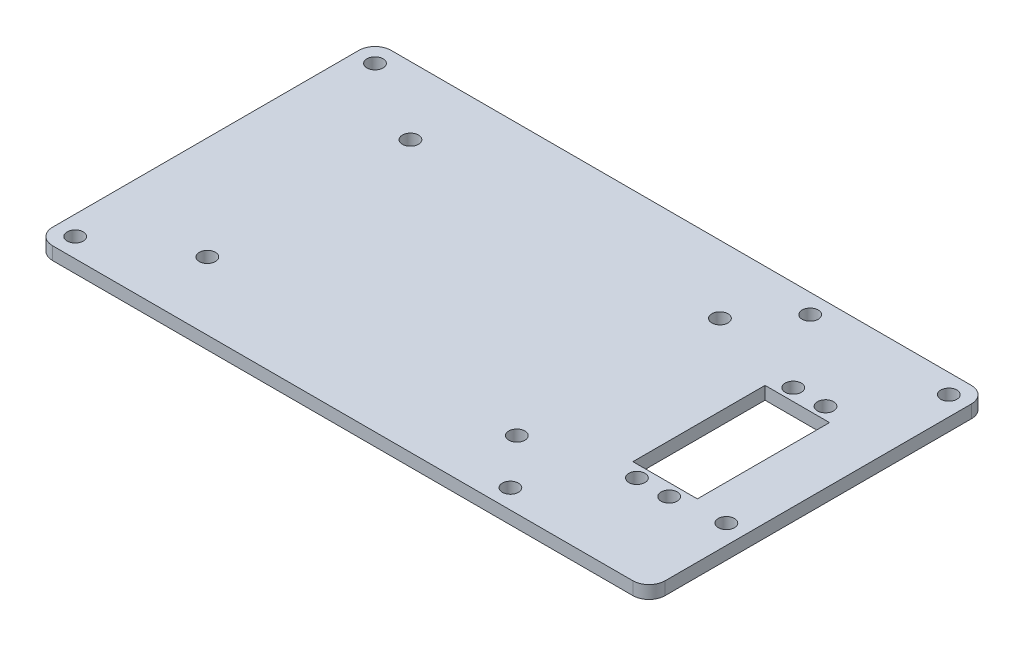
ISO-10303-21;
HEADER;
FILE_DESCRIPTION(('STEP AP214'),'2;1');
FILE_NAME('part.step','',(''),(''),'','','');
FILE_SCHEMA(('AUTOMOTIVE_DESIGN { 1 0 10303 214 1 1 1 1 }'));
ENDSEC;
DATA;
#1=APPLICATION_CONTEXT('core data for automotive mechanical design processes');
#2=APPLICATION_PROTOCOL_DEFINITION('international standard','automotive_design',2000,#1);
#3=PRODUCT_CONTEXT('',#1,'mechanical');
#4=PRODUCT('Part','Part','',(#3));
#5=PRODUCT_RELATED_PRODUCT_CATEGORY('part','',(#4));
#6=PRODUCT_DEFINITION_FORMATION('','',#4);
#7=PRODUCT_DEFINITION_CONTEXT('part definition',#1,'design');
#8=PRODUCT_DEFINITION('design','',#6,#7);
#9=PRODUCT_DEFINITION_SHAPE('','',#8);
#10=(LENGTH_UNIT() NAMED_UNIT(*) SI_UNIT(.MILLI.,.METRE.));
#11=(NAMED_UNIT(*) PLANE_ANGLE_UNIT() SI_UNIT($,.RADIAN.));
#12=(NAMED_UNIT(*) SI_UNIT($,.STERADIAN.) SOLID_ANGLE_UNIT());
#13=UNCERTAINTY_MEASURE_WITH_UNIT(LENGTH_MEASURE(1.E-05),#10,'distance_accuracy_value','');
#14=(GEOMETRIC_REPRESENTATION_CONTEXT(3) GLOBAL_UNCERTAINTY_ASSIGNED_CONTEXT((#13)) GLOBAL_UNIT_ASSIGNED_CONTEXT((#10,
#11,#12)) REPRESENTATION_CONTEXT('',''));
#15=CARTESIAN_POINT('',(0.,0.,0.));
#16=DIRECTION('',(0.,0.,1.));
#17=DIRECTION('',(1.,0.,0.));
#18=AXIS2_PLACEMENT_3D('',#15,#16,#17);
#19=CARTESIAN_POINT('',(0.,4.,0.));
#20=DIRECTION('',(0.,-1.,0.));
#21=DIRECTION('',(0.,0.,-1.));
#22=AXIS2_PLACEMENT_3D('',#19,#20,#21);
#23=PLANE('',#22);
#24=CARTESIAN_POINT('',(46.,4.,46.5));
#25=DIRECTION('',(0.,1.,0.));
#26=DIRECTION('',(0.,0.,1.));
#27=AXIS2_PLACEMENT_3D('',#24,#25,#26);
#28=CIRCLE('',#27,2.5);
#29=CARTESIAN_POINT('',(46.,4.,49.));
#30=VERTEX_POINT('',#29);
#31=EDGE_CURVE('E435',#30,#30,#28,.T.);
#32=ORIENTED_EDGE('',*,*,#31,.F.);
#33=EDGE_LOOP('',(#32));
#34=FACE_BOUND('',#33,.T.);
#35=CARTESIAN_POINT('',(73.,4.,24.25));
#36=DIRECTION('',(0.,1.,0.));
#37=DIRECTION('',(0.,0.,1.));
#38=AXIS2_PLACEMENT_3D('',#35,#36,#37);
#39=CIRCLE('',#38,2.5);
#40=CARTESIAN_POINT('',(73.,4.,26.75));
#41=VERTEX_POINT('',#40);
#42=EDGE_CURVE('E445',#41,#41,#39,.T.);
#43=ORIENTED_EDGE('',*,*,#42,.F.);
#44=EDGE_LOOP('',(#43));
#45=FACE_BOUND('',#44,.T.);
#46=CARTESIAN_POINT('',(73.,4.,-24.25));
#47=DIRECTION('',(0.,1.,0.));
#48=DIRECTION('',(0.,0.,1.));
#49=AXIS2_PLACEMENT_3D('',#46,#47,#48);
#50=CIRCLE('',#49,2.5);
#51=CARTESIAN_POINT('',(73.,4.,-21.75));
#52=VERTEX_POINT('',#51);
#53=EDGE_CURVE('E455',#52,#52,#50,.T.);
#54=ORIENTED_EDGE('',*,*,#53,.F.);
#55=EDGE_LOOP('',(#54));
#56=FACE_BOUND('',#55,.T.);
#57=DIRECTION('',(0.,0.,-1.));
#58=VECTOR('',#57,1.);
#59=CARTESIAN_POINT('',(78.,4.,-20.5));
#60=LINE('',#59,#58);
#61=CARTESIAN_POINT('',(78.,4.,20.5));
#62=VERTEX_POINT('',#61);
#63=CARTESIAN_POINT('',(78.,4.,-20.5));
#64=VERTEX_POINT('',#63);
#65=EDGE_CURVE('E127',#62,#64,#60,.T.);
#66=ORIENTED_EDGE('',*,*,#65,.F.);
#67=DIRECTION('',(1.,0.,0.));
#68=VECTOR('',#67,1.);
#69=CARTESIAN_POINT('',(58.,4.,20.5));
#70=LINE('',#69,#68);
#71=CARTESIAN_POINT('',(58.,4.,20.5));
#72=VERTEX_POINT('',#71);
#73=EDGE_CURVE('E153',#72,#62,#70,.T.);
#74=ORIENTED_EDGE('',*,*,#73,.F.);
#75=DIRECTION('',(0.,0.,1.));
#76=VECTOR('',#75,1.);
#77=CARTESIAN_POINT('',(58.,4.,-20.5));
#78=LINE('',#77,#76);
#79=CARTESIAN_POINT('',(58.,4.,-20.5));
#80=VERTEX_POINT('',#79);
#81=EDGE_CURVE('E151',#80,#72,#78,.T.);
#82=ORIENTED_EDGE('',*,*,#81,.F.);
#83=DIRECTION('',(-1.,0.,0.));
#84=VECTOR('',#83,1.);
#85=CARTESIAN_POINT('',(58.,4.,-20.5));
#86=LINE('',#85,#84);
#87=EDGE_CURVE('E137',#64,#80,#86,.T.);
#88=ORIENTED_EDGE('',*,*,#87,.F.);
#89=EDGE_LOOP('',(#66,#74,#82,#88));
#90=FACE_BOUND('',#89,.T.);
#91=CARTESIAN_POINT('',(-63.,4.,31.5));
#92=DIRECTION('',(0.,1.,0.));
#93=DIRECTION('',(0.,0.,1.));
#94=AXIS2_PLACEMENT_3D('',#91,#92,#93);
#95=CIRCLE('',#94,2.5);
#96=CARTESIAN_POINT('',(-63.,4.,34.));
#97=VERTEX_POINT('',#96);
#98=EDGE_CURVE('E177',#97,#97,#95,.T.);
#99=ORIENTED_EDGE('',*,*,#98,.F.);
#100=EDGE_LOOP('',(#99));
#101=FACE_BOUND('',#100,.T.);
#102=CARTESIAN_POINT('',(-63.,4.,-31.5));
#103=DIRECTION('',(0.,1.,0.));
#104=DIRECTION('',(0.,0.,1.));
#105=AXIS2_PLACEMENT_3D('',#102,#103,#104);
#106=CIRCLE('',#105,2.5);
#107=CARTESIAN_POINT('',(-63.,4.,-29.));
#108=VERTEX_POINT('',#107);
#109=EDGE_CURVE('E189',#108,#108,#106,.T.);
#110=ORIENTED_EDGE('',*,*,#109,.F.);
#111=EDGE_LOOP('',(#110));
#112=FACE_BOUND('',#111,.T.);
#113=CARTESIAN_POINT('',(89.,4.,-46.5));
#114=DIRECTION('',(0.,1.,0.));
#115=DIRECTION('',(0.,0.,1.));
#116=AXIS2_PLACEMENT_3D('',#113,#114,#115);
#117=CIRCLE('',#116,2.5);
#118=CARTESIAN_POINT('',(89.,4.,-44.));
#119=VERTEX_POINT('',#118);
#120=EDGE_CURVE('E201',#119,#119,#117,.T.);
#121=ORIENTED_EDGE('',*,*,#120,.F.);
#122=EDGE_LOOP('',(#121));
#123=FACE_BOUND('',#122,.T.);
#124=DIRECTION('',(-1.,0.,0.));
#125=VECTOR('',#124,1.);
#126=CARTESIAN_POINT('',(-95.,4.,-52.5));
#127=LINE('',#126,#125);
#128=CARTESIAN_POINT('',(90.,4.,-52.5));
#129=VERTEX_POINT('',#128);
#130=CARTESIAN_POINT('',(-90.,4.,-52.5));
#131=VERTEX_POINT('',#130);
#132=EDGE_CURVE('E216',#129,#131,#127,.T.);
#133=ORIENTED_EDGE('',*,*,#132,.T.);
#134=CARTESIAN_POINT('',(-90.,4.,-47.5));
#135=DIRECTION('',(0.,-1.,0.));
#136=DIRECTION('',(0.,0.,-1.));
#137=AXIS2_PLACEMENT_3D('',#134,#135,#136);
#138=CIRCLE('',#137,5.);
#139=CARTESIAN_POINT('',(-95.,4.,-47.5));
#140=VERTEX_POINT('',#139);
#141=EDGE_CURVE('E256',#131,#140,#138,.F.);
#142=ORIENTED_EDGE('',*,*,#141,.T.);
#143=DIRECTION('',(0.,0.,1.));
#144=VECTOR('',#143,1.);
#145=CARTESIAN_POINT('',(-95.,4.,52.5));
#146=LINE('',#145,#144);
#147=CARTESIAN_POINT('',(-95.,4.,47.5));
#148=VERTEX_POINT('',#147);
#149=EDGE_CURVE('E220',#140,#148,#146,.T.);
#150=ORIENTED_EDGE('',*,*,#149,.T.);
#151=CARTESIAN_POINT('',(-90.,4.,47.5));
#152=DIRECTION('',(0.,-1.,0.));
#153=DIRECTION('',(0.,0.,-1.));
#154=AXIS2_PLACEMENT_3D('',#151,#152,#153);
#155=CIRCLE('',#154,5.);
#156=CARTESIAN_POINT('',(-90.,4.,52.5));
#157=VERTEX_POINT('',#156);
#158=EDGE_CURVE('E57',#148,#157,#155,.F.);
#159=ORIENTED_EDGE('',*,*,#158,.T.);
#160=DIRECTION('',(1.,0.,0.));
#161=VECTOR('',#160,1.);
#162=CARTESIAN_POINT('',(-95.,4.,52.5));
#163=LINE('',#162,#161);
#164=CARTESIAN_POINT('',(90.,4.,52.5));
#165=VERTEX_POINT('',#164);
#166=EDGE_CURVE('E222',#157,#165,#163,.T.);
#167=ORIENTED_EDGE('',*,*,#166,.T.);
#168=CARTESIAN_POINT('',(90.,4.,47.5));
#169=DIRECTION('',(0.,-1.,0.));
#170=DIRECTION('',(0.,0.,-1.));
#171=AXIS2_PLACEMENT_3D('',#168,#169,#170);
#172=CIRCLE('',#171,5.);
#173=CARTESIAN_POINT('',(95.,4.,47.5));
#174=VERTEX_POINT('',#173);
#175=EDGE_CURVE('E253',#165,#174,#172,.F.);
#176=ORIENTED_EDGE('',*,*,#175,.T.);
#177=DIRECTION('',(0.,0.,-1.));
#178=VECTOR('',#177,1.);
#179=CARTESIAN_POINT('',(95.,4.,52.5));
#180=LINE('',#179,#178);
#181=CARTESIAN_POINT('',(95.,4.,-47.5));
#182=VERTEX_POINT('',#181);
#183=EDGE_CURVE('E213',#174,#182,#180,.T.);
#184=ORIENTED_EDGE('',*,*,#183,.T.);
#185=CARTESIAN_POINT('',(90.,4.,-47.5));
#186=DIRECTION('',(0.,-1.,0.));
#187=DIRECTION('',(0.,0.,-1.));
#188=AXIS2_PLACEMENT_3D('',#185,#186,#187);
#189=CIRCLE('',#188,5.);
#190=EDGE_CURVE('E251',#182,#129,#189,.F.);
#191=ORIENTED_EDGE('',*,*,#190,.T.);
#192=EDGE_LOOP('',(#133,#142,#150,#159,#167,#176,#184,#191));
#193=FACE_BOUND('',#192,.T.);
#194=CARTESIAN_POINT('',(-89.,4.,-46.5));
#195=DIRECTION('',(0.,1.,0.));
#196=DIRECTION('',(0.,0.,1.));
#197=AXIS2_PLACEMENT_3D('',#194,#195,#196);
#198=CIRCLE('',#197,2.5);
#199=CARTESIAN_POINT('',(-89.,4.,-44.));
#200=VERTEX_POINT('',#199);
#201=EDGE_CURVE('E207',#200,#200,#198,.T.);
#202=ORIENTED_EDGE('',*,*,#201,.F.);
#203=EDGE_LOOP('',(#202));
#204=FACE_BOUND('',#203,.T.);
#205=CARTESIAN_POINT('',(-89.,4.,46.5));
#206=DIRECTION('',(0.,1.,0.));
#207=DIRECTION('',(0.,0.,1.));
#208=AXIS2_PLACEMENT_3D('',#205,#206,#207);
#209=CIRCLE('',#208,2.5);
#210=CARTESIAN_POINT('',(-89.,4.,49.));
#211=VERTEX_POINT('',#210);
#212=EDGE_CURVE('E195',#211,#211,#209,.T.);
#213=ORIENTED_EDGE('',*,*,#212,.F.);
#214=EDGE_LOOP('',(#213));
#215=FACE_BOUND('',#214,.T.);
#216=CARTESIAN_POINT('',(33.,4.,-31.5));
#217=DIRECTION('',(0.,1.,0.));
#218=DIRECTION('',(0.,0.,1.));
#219=AXIS2_PLACEMENT_3D('',#216,#217,#218);
#220=CIRCLE('',#219,2.5);
#221=CARTESIAN_POINT('',(33.,4.,-29.));
#222=VERTEX_POINT('',#221);
#223=EDGE_CURVE('E183',#222,#222,#220,.T.);
#224=ORIENTED_EDGE('',*,*,#223,.F.);
#225=EDGE_LOOP('',(#224));
#226=FACE_BOUND('',#225,.T.);
#227=CARTESIAN_POINT('',(33.,4.,31.5));
#228=DIRECTION('',(0.,1.,0.));
#229=DIRECTION('',(0.,0.,1.));
#230=AXIS2_PLACEMENT_3D('',#227,#228,#229);
#231=CIRCLE('',#230,2.5);
#232=CARTESIAN_POINT('',(33.,4.,34.));
#233=VERTEX_POINT('',#232);
#234=EDGE_CURVE('E171',#233,#233,#231,.T.);
#235=ORIENTED_EDGE('',*,*,#234,.F.);
#236=EDGE_LOOP('',(#235));
#237=FACE_BOUND('',#236,.T.);
#238=CARTESIAN_POINT('',(62.9999999999999,4.,-24.25));
#239=DIRECTION('',(0.,1.,0.));
#240=DIRECTION('',(0.,0.,1.));
#241=AXIS2_PLACEMENT_3D('',#238,#239,#240);
#242=CIRCLE('',#241,2.5);
#243=CARTESIAN_POINT('',(62.9999999999999,4.,-21.75));
#244=VERTEX_POINT('',#243);
#245=EDGE_CURVE('E160',#244,#244,#242,.T.);
#246=ORIENTED_EDGE('',*,*,#245,.F.);
#247=EDGE_LOOP('',(#246));
#248=FACE_BOUND('',#247,.T.);
#249=CARTESIAN_POINT('',(62.9999999999999,4.,24.25));
#250=DIRECTION('',(0.,1.,0.));
#251=DIRECTION('',(0.,0.,1.));
#252=AXIS2_PLACEMENT_3D('',#249,#250,#251);
#253=CIRCLE('',#252,2.5);
#254=CARTESIAN_POINT('',(62.9999999999999,4.,26.75));
#255=VERTEX_POINT('',#254);
#256=EDGE_CURVE('E450',#255,#255,#253,.T.);
#257=ORIENTED_EDGE('',*,*,#256,.F.);
#258=EDGE_LOOP('',(#257));
#259=FACE_BOUND('',#258,.T.);
#260=CARTESIAN_POINT('',(46.,4.,-46.5));
#261=DIRECTION('',(0.,1.,0.));
#262=DIRECTION('',(0.,0.,1.));
#263=AXIS2_PLACEMENT_3D('',#260,#261,#262);
#264=CIRCLE('',#263,2.5);
#265=CARTESIAN_POINT('',(46.,4.,-44.));
#266=VERTEX_POINT('',#265);
#267=EDGE_CURVE('E440',#266,#266,#264,.T.);
#268=ORIENTED_EDGE('',*,*,#267,.F.);
#269=EDGE_LOOP('',(#268));
#270=FACE_BOUND('',#269,.T.);
#271=CARTESIAN_POINT('',(89.0000000000007,4.,22.5));
#272=DIRECTION('',(0.,1.,0.));
#273=DIRECTION('',(0.,0.,1.));
#274=AXIS2_PLACEMENT_3D('',#271,#272,#273);
#275=CIRCLE('',#274,2.5);
#276=CARTESIAN_POINT('',(89.0000000000007,4.,25.));
#277=VERTEX_POINT('',#276);
#278=EDGE_CURVE('E430',#277,#277,#275,.T.);
#279=ORIENTED_EDGE('',*,*,#278,.F.);
#280=EDGE_LOOP('',(#279));
#281=FACE_BOUND('',#280,.T.);
#282=ADVANCED_FACE('F35',(#34,#45,#56,#90,#101,#112,#123,#193,#204,#215,#226,#237,#248,#259,
#270,#281),#23,.F.);
#283=CARTESIAN_POINT('',(0.,0.,0.));
#284=DIRECTION('',(0.,-1.,0.));
#285=DIRECTION('',(0.,0.,-1.));
#286=AXIS2_PLACEMENT_3D('',#283,#284,#285);
#287=PLANE('',#286);
#288=CARTESIAN_POINT('',(46.,0.,46.5));
#289=DIRECTION('',(0.,1.,0.));
#290=DIRECTION('',(0.,0.,1.));
#291=AXIS2_PLACEMENT_3D('',#288,#289,#290);
#292=CIRCLE('',#291,2.5);
#293=CARTESIAN_POINT('',(46.,0.,49.));
#294=VERTEX_POINT('',#293);
#295=EDGE_CURVE('E432',#294,#294,#292,.T.);
#296=ORIENTED_EDGE('',*,*,#295,.T.);
#297=EDGE_LOOP('',(#296));
#298=FACE_BOUND('',#297,.T.);
#299=CARTESIAN_POINT('',(73.,0.,24.25));
#300=DIRECTION('',(0.,1.,0.));
#301=DIRECTION('',(0.,0.,1.));
#302=AXIS2_PLACEMENT_3D('',#299,#300,#301);
#303=CIRCLE('',#302,2.5);
#304=CARTESIAN_POINT('',(73.,0.,26.75));
#305=VERTEX_POINT('',#304);
#306=EDGE_CURVE('E443',#305,#305,#303,.T.);
#307=ORIENTED_EDGE('',*,*,#306,.T.);
#308=EDGE_LOOP('',(#307));
#309=FACE_BOUND('',#308,.T.);
#310=CARTESIAN_POINT('',(73.,0.,-24.25));
#311=DIRECTION('',(0.,1.,0.));
#312=DIRECTION('',(0.,0.,1.));
#313=AXIS2_PLACEMENT_3D('',#310,#311,#312);
#314=CIRCLE('',#313,2.5);
#315=CARTESIAN_POINT('',(73.,0.,-21.75));
#316=VERTEX_POINT('',#315);
#317=EDGE_CURVE('E453',#316,#316,#314,.T.);
#318=ORIENTED_EDGE('',*,*,#317,.T.);
#319=EDGE_LOOP('',(#318));
#320=FACE_BOUND('',#319,.T.);
#321=DIRECTION('',(1.,0.,0.));
#322=VECTOR('',#321,1.);
#323=CARTESIAN_POINT('',(58.,0.,20.5));
#324=LINE('',#323,#322);
#325=CARTESIAN_POINT('',(58.,0.,20.5));
#326=VERTEX_POINT('',#325);
#327=CARTESIAN_POINT('',(78.,0.,20.5));
#328=VERTEX_POINT('',#327);
#329=EDGE_CURVE('E138',#326,#328,#324,.T.);
#330=ORIENTED_EDGE('',*,*,#329,.T.);
#331=DIRECTION('',(0.,0.,-1.));
#332=VECTOR('',#331,1.);
#333=CARTESIAN_POINT('',(78.,0.,-20.5));
#334=LINE('',#333,#332);
#335=CARTESIAN_POINT('',(78.,0.,-20.5));
#336=VERTEX_POINT('',#335);
#337=EDGE_CURVE('E158',#328,#336,#334,.T.);
#338=ORIENTED_EDGE('',*,*,#337,.T.);
#339=DIRECTION('',(-1.,0.,0.));
#340=VECTOR('',#339,1.);
#341=CARTESIAN_POINT('',(58.,0.,-20.5));
#342=LINE('',#341,#340);
#343=CARTESIAN_POINT('',(58.,0.,-20.5));
#344=VERTEX_POINT('',#343);
#345=EDGE_CURVE('E144',#336,#344,#342,.T.);
#346=ORIENTED_EDGE('',*,*,#345,.T.);
#347=DIRECTION('',(0.,0.,1.));
#348=VECTOR('',#347,1.);
#349=CARTESIAN_POINT('',(58.,0.,-20.5));
#350=LINE('',#349,#348);
#351=EDGE_CURVE('E162',#344,#326,#350,.T.);
#352=ORIENTED_EDGE('',*,*,#351,.T.);
#353=EDGE_LOOP('',(#330,#338,#346,#352));
#354=FACE_BOUND('',#353,.T.);
#355=CARTESIAN_POINT('',(-63.,0.,31.5));
#356=DIRECTION('',(0.,1.,0.));
#357=DIRECTION('',(0.,0.,1.));
#358=AXIS2_PLACEMENT_3D('',#355,#356,#357);
#359=CIRCLE('',#358,2.5);
#360=CARTESIAN_POINT('',(-63.,0.,34.));
#361=VERTEX_POINT('',#360);
#362=EDGE_CURVE('E174',#361,#361,#359,.T.);
#363=ORIENTED_EDGE('',*,*,#362,.T.);
#364=EDGE_LOOP('',(#363));
#365=FACE_BOUND('',#364,.T.);
#366=CARTESIAN_POINT('',(-63.,0.,-31.5));
#367=DIRECTION('',(0.,1.,0.));
#368=DIRECTION('',(0.,0.,1.));
#369=AXIS2_PLACEMENT_3D('',#366,#367,#368);
#370=CIRCLE('',#369,2.5);
#371=CARTESIAN_POINT('',(-63.,0.,-29.));
#372=VERTEX_POINT('',#371);
#373=EDGE_CURVE('E186',#372,#372,#370,.T.);
#374=ORIENTED_EDGE('',*,*,#373,.T.);
#375=EDGE_LOOP('',(#374));
#376=FACE_BOUND('',#375,.T.);
#377=CARTESIAN_POINT('',(89.,0.,-46.5));
#378=DIRECTION('',(0.,1.,0.));
#379=DIRECTION('',(0.,0.,1.));
#380=AXIS2_PLACEMENT_3D('',#377,#378,#379);
#381=CIRCLE('',#380,2.5);
#382=CARTESIAN_POINT('',(89.,0.,-44.));
#383=VERTEX_POINT('',#382);
#384=EDGE_CURVE('E198',#383,#383,#381,.T.);
#385=ORIENTED_EDGE('',*,*,#384,.T.);
#386=EDGE_LOOP('',(#385));
#387=FACE_BOUND('',#386,.T.);
#388=DIRECTION('',(0.,0.,1.));
#389=VECTOR('',#388,1.);
#390=CARTESIAN_POINT('',(-95.,0.,52.5));
#391=LINE('',#390,#389);
#392=CARTESIAN_POINT('',(-95.,0.,-47.5));
#393=VERTEX_POINT('',#392);
#394=CARTESIAN_POINT('',(-95.,0.,47.5));
#395=VERTEX_POINT('',#394);
#396=EDGE_CURVE('E230',#393,#395,#391,.T.);
#397=ORIENTED_EDGE('',*,*,#396,.F.);
#398=CARTESIAN_POINT('',(-90.,0.,-47.5));
#399=DIRECTION('',(0.,-1.,0.));
#400=DIRECTION('',(0.,0.,-1.));
#401=AXIS2_PLACEMENT_3D('',#398,#399,#400);
#402=CIRCLE('',#401,5.);
#403=CARTESIAN_POINT('',(-90.,0.,-52.5));
#404=VERTEX_POINT('',#403);
#405=EDGE_CURVE('E244',#393,#404,#402,.T.);
#406=ORIENTED_EDGE('',*,*,#405,.T.);
#407=DIRECTION('',(-1.,0.,0.));
#408=VECTOR('',#407,1.);
#409=CARTESIAN_POINT('',(-95.,0.,-52.5));
#410=LINE('',#409,#408);
#411=CARTESIAN_POINT('',(90.,0.,-52.5));
#412=VERTEX_POINT('',#411);
#413=EDGE_CURVE('E227',#412,#404,#410,.T.);
#414=ORIENTED_EDGE('',*,*,#413,.F.);
#415=CARTESIAN_POINT('',(90.,0.,-47.5));
#416=DIRECTION('',(0.,-1.,0.));
#417=DIRECTION('',(0.,0.,-1.));
#418=AXIS2_PLACEMENT_3D('',#415,#416,#417);
#419=CIRCLE('',#418,5.);
#420=CARTESIAN_POINT('',(95.,0.,-47.5));
#421=VERTEX_POINT('',#420);
#422=EDGE_CURVE('E238',#412,#421,#419,.T.);
#423=ORIENTED_EDGE('',*,*,#422,.T.);
#424=DIRECTION('',(0.,0.,-1.));
#425=VECTOR('',#424,1.);
#426=CARTESIAN_POINT('',(95.,0.,52.5));
#427=LINE('',#426,#425);
#428=CARTESIAN_POINT('',(95.,0.,47.5));
#429=VERTEX_POINT('',#428);
#430=EDGE_CURVE('E210',#429,#421,#427,.T.);
#431=ORIENTED_EDGE('',*,*,#430,.F.);
#432=CARTESIAN_POINT('',(90.,0.,47.5));
#433=DIRECTION('',(0.,-1.,0.));
#434=DIRECTION('',(0.,0.,-1.));
#435=AXIS2_PLACEMENT_3D('',#432,#433,#434);
#436=CIRCLE('',#435,5.);
#437=CARTESIAN_POINT('',(90.,0.,52.5));
#438=VERTEX_POINT('',#437);
#439=EDGE_CURVE('E240',#429,#438,#436,.T.);
#440=ORIENTED_EDGE('',*,*,#439,.T.);
#441=DIRECTION('',(1.,0.,0.));
#442=VECTOR('',#441,1.);
#443=CARTESIAN_POINT('',(-95.,0.,52.5));
#444=LINE('',#443,#442);
#445=CARTESIAN_POINT('',(-90.,0.,52.5));
#446=VERTEX_POINT('',#445);
#447=EDGE_CURVE('E217',#446,#438,#444,.T.);
#448=ORIENTED_EDGE('',*,*,#447,.F.);
#449=CARTESIAN_POINT('',(-90.,0.,47.5));
#450=DIRECTION('',(0.,-1.,0.));
#451=DIRECTION('',(0.,0.,-1.));
#452=AXIS2_PLACEMENT_3D('',#449,#450,#451);
#453=CIRCLE('',#452,5.);
#454=EDGE_CURVE('E242',#446,#395,#453,.T.);
#455=ORIENTED_EDGE('',*,*,#454,.T.);
#456=EDGE_LOOP('',(#397,#406,#414,#423,#431,#440,#448,#455));
#457=FACE_BOUND('',#456,.T.);
#458=CARTESIAN_POINT('',(-89.,0.,-46.5));
#459=DIRECTION('',(0.,1.,0.));
#460=DIRECTION('',(0.,0.,1.));
#461=AXIS2_PLACEMENT_3D('',#458,#459,#460);
#462=CIRCLE('',#461,2.5);
#463=CARTESIAN_POINT('',(-89.,0.,-44.));
#464=VERTEX_POINT('',#463);
#465=EDGE_CURVE('E204',#464,#464,#462,.T.);
#466=ORIENTED_EDGE('',*,*,#465,.T.);
#467=EDGE_LOOP('',(#466));
#468=FACE_BOUND('',#467,.T.);
#469=CARTESIAN_POINT('',(-89.,0.,46.5));
#470=DIRECTION('',(0.,1.,0.));
#471=DIRECTION('',(0.,0.,1.));
#472=AXIS2_PLACEMENT_3D('',#469,#470,#471);
#473=CIRCLE('',#472,2.5);
#474=CARTESIAN_POINT('',(-89.,0.,49.));
#475=VERTEX_POINT('',#474);
#476=EDGE_CURVE('E192',#475,#475,#473,.T.);
#477=ORIENTED_EDGE('',*,*,#476,.T.);
#478=EDGE_LOOP('',(#477));
#479=FACE_BOUND('',#478,.T.);
#480=CARTESIAN_POINT('',(33.,0.,-31.5));
#481=DIRECTION('',(0.,1.,0.));
#482=DIRECTION('',(0.,0.,1.));
#483=AXIS2_PLACEMENT_3D('',#480,#481,#482);
#484=CIRCLE('',#483,2.5);
#485=CARTESIAN_POINT('',(33.,0.,-29.));
#486=VERTEX_POINT('',#485);
#487=EDGE_CURVE('E180',#486,#486,#484,.T.);
#488=ORIENTED_EDGE('',*,*,#487,.T.);
#489=EDGE_LOOP('',(#488));
#490=FACE_BOUND('',#489,.T.);
#491=CARTESIAN_POINT('',(33.,0.,31.5));
#492=DIRECTION('',(0.,1.,0.));
#493=DIRECTION('',(0.,0.,1.));
#494=AXIS2_PLACEMENT_3D('',#491,#492,#493);
#495=CIRCLE('',#494,2.5);
#496=CARTESIAN_POINT('',(33.,0.,34.));
#497=VERTEX_POINT('',#496);
#498=EDGE_CURVE('E145',#497,#497,#495,.T.);
#499=ORIENTED_EDGE('',*,*,#498,.T.);
#500=EDGE_LOOP('',(#499));
#501=FACE_BOUND('',#500,.T.);
#502=CARTESIAN_POINT('',(62.9999999999999,0.,-24.25));
#503=DIRECTION('',(0.,1.,0.));
#504=DIRECTION('',(0.,0.,1.));
#505=AXIS2_PLACEMENT_3D('',#502,#503,#504);
#506=CIRCLE('',#505,2.5);
#507=CARTESIAN_POINT('',(62.9999999999999,0.,-21.75));
#508=VERTEX_POINT('',#507);
#509=EDGE_CURVE('E418',#508,#508,#506,.T.);
#510=ORIENTED_EDGE('',*,*,#509,.T.);
#511=EDGE_LOOP('',(#510));
#512=FACE_BOUND('',#511,.T.);
#513=CARTESIAN_POINT('',(62.9999999999999,0.,24.25));
#514=DIRECTION('',(0.,1.,0.));
#515=DIRECTION('',(0.,0.,1.));
#516=AXIS2_PLACEMENT_3D('',#513,#514,#515);
#517=CIRCLE('',#516,2.5);
#518=CARTESIAN_POINT('',(62.9999999999999,0.,26.75));
#519=VERTEX_POINT('',#518);
#520=EDGE_CURVE('E422',#519,#519,#517,.T.);
#521=ORIENTED_EDGE('',*,*,#520,.T.);
#522=EDGE_LOOP('',(#521));
#523=FACE_BOUND('',#522,.T.);
#524=CARTESIAN_POINT('',(46.,0.,-46.5));
#525=DIRECTION('',(0.,1.,0.));
#526=DIRECTION('',(0.,0.,1.));
#527=AXIS2_PLACEMENT_3D('',#524,#525,#526);
#528=CIRCLE('',#527,2.5);
#529=CARTESIAN_POINT('',(46.,0.,-44.));
#530=VERTEX_POINT('',#529);
#531=EDGE_CURVE('E426',#530,#530,#528,.T.);
#532=ORIENTED_EDGE('',*,*,#531,.T.);
#533=EDGE_LOOP('',(#532));
#534=FACE_BOUND('',#533,.T.);
#535=CARTESIAN_POINT('',(89.0000000000007,0.,22.5));
#536=DIRECTION('',(0.,1.,0.));
#537=DIRECTION('',(0.,0.,1.));
#538=AXIS2_PLACEMENT_3D('',#535,#536,#537);
#539=CIRCLE('',#538,2.5);
#540=CARTESIAN_POINT('',(89.0000000000007,0.,25.));
#541=VERTEX_POINT('',#540);
#542=EDGE_CURVE('E429',#541,#541,#539,.T.);
#543=ORIENTED_EDGE('',*,*,#542,.T.);
#544=EDGE_LOOP('',(#543));
#545=FACE_BOUND('',#544,.T.);
#546=ADVANCED_FACE('F279',(#298,#309,#320,#354,#365,#376,#387,#457,#468,#479,#490,#501,#512,
#523,#534,#545),#287,.T.);
#547=CARTESIAN_POINT('',(95.,4.,52.5));
#548=DIRECTION('',(-1.,0.,0.));
#549=DIRECTION('',(0.,0.,1.));
#550=AXIS2_PLACEMENT_3D('',#547,#548,#549);
#551=PLANE('',#550);
#552=ORIENTED_EDGE('',*,*,#183,.F.);
#553=DIRECTION('',(0.,-1.,0.));
#554=VECTOR('',#553,1.);
#555=CARTESIAN_POINT('',(95.,4.,47.5));
#556=LINE('',#555,#554);
#557=EDGE_CURVE('E11',#174,#429,#556,.T.);
#558=ORIENTED_EDGE('',*,*,#557,.T.);
#559=ORIENTED_EDGE('',*,*,#430,.T.);
#560=DIRECTION('',(0.,-1.,0.));
#561=VECTOR('',#560,1.);
#562=CARTESIAN_POINT('',(95.,4.,-47.5));
#563=LINE('',#562,#561);
#564=EDGE_CURVE('E43',#421,#182,#563,.F.);
#565=ORIENTED_EDGE('',*,*,#564,.T.);
#566=EDGE_LOOP('',(#552,#558,#559,#565));
#567=FACE_BOUND('',#566,.T.);
#568=ADVANCED_FACE('F264',(#567),#551,.F.);
#569=CARTESIAN_POINT('',(-95.,4.,-52.5));
#570=DIRECTION('',(0.,0.,1.));
#571=DIRECTION('',(1.,0.,0.));
#572=AXIS2_PLACEMENT_3D('',#569,#570,#571);
#573=PLANE('',#572);
#574=ORIENTED_EDGE('',*,*,#413,.T.);
#575=DIRECTION('',(0.,-1.,0.));
#576=VECTOR('',#575,1.);
#577=CARTESIAN_POINT('',(-90.,4.,-52.5));
#578=LINE('',#577,#576);
#579=EDGE_CURVE('E249',#404,#131,#578,.F.);
#580=ORIENTED_EDGE('',*,*,#579,.T.);
#581=ORIENTED_EDGE('',*,*,#132,.F.);
#582=DIRECTION('',(0.,-1.,0.));
#583=VECTOR('',#582,1.);
#584=CARTESIAN_POINT('',(90.,4.,-52.5));
#585=LINE('',#584,#583);
#586=EDGE_CURVE('E246',#129,#412,#585,.T.);
#587=ORIENTED_EDGE('',*,*,#586,.T.);
#588=EDGE_LOOP('',(#574,#580,#581,#587));
#589=FACE_BOUND('',#588,.T.);
#590=ADVANCED_FACE('F275',(#589),#573,.F.);
#591=CARTESIAN_POINT('',(-95.,4.,52.5));
#592=DIRECTION('',(1.,0.,0.));
#593=DIRECTION('',(0.,0.,-1.));
#594=AXIS2_PLACEMENT_3D('',#591,#592,#593);
#595=PLANE('',#594);
#596=ORIENTED_EDGE('',*,*,#149,.F.);
#597=DIRECTION('',(0.,-1.,0.));
#598=VECTOR('',#597,1.);
#599=CARTESIAN_POINT('',(-95.,4.,-47.5));
#600=LINE('',#599,#598);
#601=EDGE_CURVE('E235',#140,#393,#600,.T.);
#602=ORIENTED_EDGE('',*,*,#601,.T.);
#603=ORIENTED_EDGE('',*,*,#396,.T.);
#604=DIRECTION('',(0.,-1.,0.));
#605=VECTOR('',#604,1.);
#606=CARTESIAN_POINT('',(-95.,4.,47.5));
#607=LINE('',#606,#605);
#608=EDGE_CURVE('E224',#395,#148,#607,.F.);
#609=ORIENTED_EDGE('',*,*,#608,.T.);
#610=EDGE_LOOP('',(#596,#602,#603,#609));
#611=FACE_BOUND('',#610,.T.);
#612=ADVANCED_FACE('F287',(#611),#595,.F.);
#613=CARTESIAN_POINT('',(-95.,4.,52.5));
#614=DIRECTION('',(0.,0.,-1.));
#615=DIRECTION('',(-1.,0.,0.));
#616=AXIS2_PLACEMENT_3D('',#613,#614,#615);
#617=PLANE('',#616);
#618=ORIENTED_EDGE('',*,*,#166,.F.);
#619=DIRECTION('',(0.,-1.,0.));
#620=VECTOR('',#619,1.);
#621=CARTESIAN_POINT('',(-90.,4.,52.5));
#622=LINE('',#621,#620);
#623=EDGE_CURVE('E259',#157,#446,#622,.T.);
#624=ORIENTED_EDGE('',*,*,#623,.T.);
#625=ORIENTED_EDGE('',*,*,#447,.T.);
#626=DIRECTION('',(0.,-1.,0.));
#627=VECTOR('',#626,1.);
#628=CARTESIAN_POINT('',(90.,4.,52.5));
#629=LINE('',#628,#627);
#630=EDGE_CURVE('E50',#438,#165,#629,.F.);
#631=ORIENTED_EDGE('',*,*,#630,.T.);
#632=EDGE_LOOP('',(#618,#624,#625,#631));
#633=FACE_BOUND('',#632,.T.);
#634=ADVANCED_FACE('F293',(#633),#617,.F.);
#635=CARTESIAN_POINT('',(-89.,4.,-46.5));
#636=DIRECTION('',(0.,-1.,0.));
#637=DIRECTION('',(0.,0.,-1.));
#638=AXIS2_PLACEMENT_3D('',#635,#636,#637);
#639=CYLINDRICAL_SURFACE('',#638,2.5);
#640=ORIENTED_EDGE('',*,*,#201,.T.);
#641=EDGE_LOOP('',(#640));
#642=FACE_BOUND('',#641,.T.);
#643=ORIENTED_EDGE('',*,*,#465,.F.);
#644=EDGE_LOOP('',(#643));
#645=FACE_BOUND('',#644,.T.);
#646=ADVANCED_FACE('F313',(#642,#645),#639,.F.);
#647=CARTESIAN_POINT('',(89.,4.,-46.5));
#648=DIRECTION('',(0.,-1.,0.));
#649=DIRECTION('',(0.,0.,-1.));
#650=AXIS2_PLACEMENT_3D('',#647,#648,#649);
#651=CYLINDRICAL_SURFACE('',#650,2.5);
#652=ORIENTED_EDGE('',*,*,#120,.T.);
#653=EDGE_LOOP('',(#652));
#654=FACE_BOUND('',#653,.T.);
#655=ORIENTED_EDGE('',*,*,#384,.F.);
#656=EDGE_LOOP('',(#655));
#657=FACE_BOUND('',#656,.T.);
#658=ADVANCED_FACE('F390',(#654,#657),#651,.F.);
#659=CARTESIAN_POINT('',(-89.,4.,46.5));
#660=DIRECTION('',(0.,-1.,0.));
#661=DIRECTION('',(0.,0.,-1.));
#662=AXIS2_PLACEMENT_3D('',#659,#660,#661);
#663=CYLINDRICAL_SURFACE('',#662,2.5);
#664=ORIENTED_EDGE('',*,*,#212,.T.);
#665=EDGE_LOOP('',(#664));
#666=FACE_BOUND('',#665,.T.);
#667=ORIENTED_EDGE('',*,*,#476,.F.);
#668=EDGE_LOOP('',(#667));
#669=FACE_BOUND('',#668,.T.);
#670=ADVANCED_FACE('F387',(#666,#669),#663,.F.);
#671=CARTESIAN_POINT('',(-63.,4.,-31.5));
#672=DIRECTION('',(0.,-1.,0.));
#673=DIRECTION('',(0.,0.,-1.));
#674=AXIS2_PLACEMENT_3D('',#671,#672,#673);
#675=CYLINDRICAL_SURFACE('',#674,2.5);
#676=ORIENTED_EDGE('',*,*,#109,.T.);
#677=EDGE_LOOP('',(#676));
#678=FACE_BOUND('',#677,.T.);
#679=ORIENTED_EDGE('',*,*,#373,.F.);
#680=EDGE_LOOP('',(#679));
#681=FACE_BOUND('',#680,.T.);
#682=ADVANCED_FACE('F383',(#678,#681),#675,.F.);
#683=CARTESIAN_POINT('',(33.,4.,-31.5));
#684=DIRECTION('',(0.,-1.,0.));
#685=DIRECTION('',(0.,0.,-1.));
#686=AXIS2_PLACEMENT_3D('',#683,#684,#685);
#687=CYLINDRICAL_SURFACE('',#686,2.5);
#688=ORIENTED_EDGE('',*,*,#223,.T.);
#689=EDGE_LOOP('',(#688));
#690=FACE_BOUND('',#689,.T.);
#691=ORIENTED_EDGE('',*,*,#487,.F.);
#692=EDGE_LOOP('',(#691));
#693=FACE_BOUND('',#692,.T.);
#694=ADVANCED_FACE('F379',(#690,#693),#687,.F.);
#695=CARTESIAN_POINT('',(-63.,4.,31.5));
#696=DIRECTION('',(0.,-1.,0.));
#697=DIRECTION('',(0.,0.,-1.));
#698=AXIS2_PLACEMENT_3D('',#695,#696,#697);
#699=CYLINDRICAL_SURFACE('',#698,2.5);
#700=ORIENTED_EDGE('',*,*,#98,.T.);
#701=EDGE_LOOP('',(#700));
#702=FACE_BOUND('',#701,.T.);
#703=ORIENTED_EDGE('',*,*,#362,.F.);
#704=EDGE_LOOP('',(#703));
#705=FACE_BOUND('',#704,.T.);
#706=ADVANCED_FACE('F375',(#702,#705),#699,.F.);
#707=CARTESIAN_POINT('',(33.,4.,31.5));
#708=DIRECTION('',(0.,-1.,0.));
#709=DIRECTION('',(0.,0.,-1.));
#710=AXIS2_PLACEMENT_3D('',#707,#708,#709);
#711=CYLINDRICAL_SURFACE('',#710,2.5);
#712=ORIENTED_EDGE('',*,*,#234,.T.);
#713=EDGE_LOOP('',(#712));
#714=FACE_BOUND('',#713,.T.);
#715=ORIENTED_EDGE('',*,*,#498,.F.);
#716=EDGE_LOOP('',(#715));
#717=FACE_BOUND('',#716,.T.);
#718=ADVANCED_FACE('F372',(#714,#717),#711,.F.);
#719=CARTESIAN_POINT('',(78.,4.,-20.5));
#720=DIRECTION('',(-1.,0.,0.));
#721=DIRECTION('',(0.,0.,1.));
#722=AXIS2_PLACEMENT_3D('',#719,#720,#721);
#723=PLANE('',#722);
#724=ORIENTED_EDGE('',*,*,#337,.F.);
#725=DIRECTION('',(0.,-1.,0.));
#726=VECTOR('',#725,1.);
#727=CARTESIAN_POINT('',(78.,4.,20.5));
#728=LINE('',#727,#726);
#729=EDGE_CURVE('E133',#62,#328,#728,.T.);
#730=ORIENTED_EDGE('',*,*,#729,.F.);
#731=ORIENTED_EDGE('',*,*,#65,.T.);
#732=DIRECTION('',(0.,-1.,0.));
#733=VECTOR('',#732,1.);
#734=CARTESIAN_POINT('',(78.,4.,-20.5));
#735=LINE('',#734,#733);
#736=EDGE_CURVE('E130',#64,#336,#735,.T.);
#737=ORIENTED_EDGE('',*,*,#736,.T.);
#738=EDGE_LOOP('',(#724,#730,#731,#737));
#739=FACE_BOUND('',#738,.T.);
#740=ADVANCED_FACE('F129',(#739),#723,.T.);
#741=CARTESIAN_POINT('',(58.,4.,-20.5));
#742=DIRECTION('',(0.,0.,1.));
#743=DIRECTION('',(1.,0.,0.));
#744=AXIS2_PLACEMENT_3D('',#741,#742,#743);
#745=PLANE('',#744);
#746=ORIENTED_EDGE('',*,*,#345,.F.);
#747=ORIENTED_EDGE('',*,*,#736,.F.);
#748=ORIENTED_EDGE('',*,*,#87,.T.);
#749=DIRECTION('',(0.,-1.,0.));
#750=VECTOR('',#749,1.);
#751=CARTESIAN_POINT('',(58.,4.,-20.5));
#752=LINE('',#751,#750);
#753=EDGE_CURVE('E146',#80,#344,#752,.T.);
#754=ORIENTED_EDGE('',*,*,#753,.T.);
#755=EDGE_LOOP('',(#746,#747,#748,#754));
#756=FACE_BOUND('',#755,.T.);
#757=ADVANCED_FACE('F141',(#756),#745,.T.);
#758=CARTESIAN_POINT('',(58.,4.,-20.5));
#759=DIRECTION('',(1.,0.,0.));
#760=DIRECTION('',(0.,0.,-1.));
#761=AXIS2_PLACEMENT_3D('',#758,#759,#760);
#762=PLANE('',#761);
#763=ORIENTED_EDGE('',*,*,#351,.F.);
#764=ORIENTED_EDGE('',*,*,#753,.F.);
#765=ORIENTED_EDGE('',*,*,#81,.T.);
#766=DIRECTION('',(0.,-1.,0.));
#767=VECTOR('',#766,1.);
#768=CARTESIAN_POINT('',(58.,4.,20.5));
#769=LINE('',#768,#767);
#770=EDGE_CURVE('E168',#72,#326,#769,.T.);
#771=ORIENTED_EDGE('',*,*,#770,.T.);
#772=EDGE_LOOP('',(#763,#764,#765,#771));
#773=FACE_BOUND('',#772,.T.);
#774=ADVANCED_FACE('F363',(#773),#762,.T.);
#775=CARTESIAN_POINT('',(58.,4.,20.5));
#776=DIRECTION('',(0.,0.,-1.));
#777=DIRECTION('',(-1.,0.,0.));
#778=AXIS2_PLACEMENT_3D('',#775,#776,#777);
#779=PLANE('',#778);
#780=ORIENTED_EDGE('',*,*,#329,.F.);
#781=ORIENTED_EDGE('',*,*,#770,.F.);
#782=ORIENTED_EDGE('',*,*,#73,.T.);
#783=ORIENTED_EDGE('',*,*,#729,.T.);
#784=EDGE_LOOP('',(#780,#781,#782,#783));
#785=FACE_BOUND('',#784,.T.);
#786=ADVANCED_FACE('F359',(#785),#779,.T.);
#787=CARTESIAN_POINT('',(62.9999999999999,4.,-24.25));
#788=DIRECTION('',(0.,-1.,0.));
#789=DIRECTION('',(0.,0.,-1.));
#790=AXIS2_PLACEMENT_3D('',#787,#788,#789);
#791=CYLINDRICAL_SURFACE('',#790,2.5);
#792=ORIENTED_EDGE('',*,*,#245,.T.);
#793=EDGE_LOOP('',(#792));
#794=FACE_BOUND('',#793,.T.);
#795=ORIENTED_EDGE('',*,*,#509,.F.);
#796=EDGE_LOOP('',(#795));
#797=FACE_BOUND('',#796,.T.);
#798=ADVANCED_FACE('F355',(#794,#797),#791,.F.);
#799=CARTESIAN_POINT('',(73.,4.,-24.25));
#800=DIRECTION('',(0.,-1.,0.));
#801=DIRECTION('',(0.,0.,-1.));
#802=AXIS2_PLACEMENT_3D('',#799,#800,#801);
#803=CYLINDRICAL_SURFACE('',#802,2.5);
#804=ORIENTED_EDGE('',*,*,#53,.T.);
#805=EDGE_LOOP('',(#804));
#806=FACE_BOUND('',#805,.T.);
#807=ORIENTED_EDGE('',*,*,#317,.F.);
#808=EDGE_LOOP('',(#807));
#809=FACE_BOUND('',#808,.T.);
#810=ADVANCED_FACE('F351',(#806,#809),#803,.F.);
#811=CARTESIAN_POINT('',(62.9999999999999,4.,24.25));
#812=DIRECTION('',(0.,-1.,0.));
#813=DIRECTION('',(0.,0.,-1.));
#814=AXIS2_PLACEMENT_3D('',#811,#812,#813);
#815=CYLINDRICAL_SURFACE('',#814,2.5);
#816=ORIENTED_EDGE('',*,*,#256,.T.);
#817=EDGE_LOOP('',(#816));
#818=FACE_BOUND('',#817,.T.);
#819=ORIENTED_EDGE('',*,*,#520,.F.);
#820=EDGE_LOOP('',(#819));
#821=FACE_BOUND('',#820,.T.);
#822=ADVANCED_FACE('F347',(#818,#821),#815,.F.);
#823=CARTESIAN_POINT('',(73.,4.,24.25));
#824=DIRECTION('',(0.,-1.,0.));
#825=DIRECTION('',(0.,0.,-1.));
#826=AXIS2_PLACEMENT_3D('',#823,#824,#825);
#827=CYLINDRICAL_SURFACE('',#826,2.5);
#828=ORIENTED_EDGE('',*,*,#42,.T.);
#829=EDGE_LOOP('',(#828));
#830=FACE_BOUND('',#829,.T.);
#831=ORIENTED_EDGE('',*,*,#306,.F.);
#832=EDGE_LOOP('',(#831));
#833=FACE_BOUND('',#832,.T.);
#834=ADVANCED_FACE('F343',(#830,#833),#827,.F.);
#835=CARTESIAN_POINT('',(46.,4.,-46.5));
#836=DIRECTION('',(0.,-1.,0.));
#837=DIRECTION('',(0.,0.,-1.));
#838=AXIS2_PLACEMENT_3D('',#835,#836,#837);
#839=CYLINDRICAL_SURFACE('',#838,2.5);
#840=ORIENTED_EDGE('',*,*,#267,.T.);
#841=EDGE_LOOP('',(#840));
#842=FACE_BOUND('',#841,.T.);
#843=ORIENTED_EDGE('',*,*,#531,.F.);
#844=EDGE_LOOP('',(#843));
#845=FACE_BOUND('',#844,.T.);
#846=ADVANCED_FACE('F335',(#842,#845),#839,.F.);
#847=CARTESIAN_POINT('',(46.,4.,46.5));
#848=DIRECTION('',(0.,-1.,0.));
#849=DIRECTION('',(0.,0.,-1.));
#850=AXIS2_PLACEMENT_3D('',#847,#848,#849);
#851=CYLINDRICAL_SURFACE('',#850,2.5);
#852=ORIENTED_EDGE('',*,*,#31,.T.);
#853=EDGE_LOOP('',(#852));
#854=FACE_BOUND('',#853,.T.);
#855=ORIENTED_EDGE('',*,*,#295,.F.);
#856=EDGE_LOOP('',(#855));
#857=FACE_BOUND('',#856,.T.);
#858=ADVANCED_FACE('F329',(#854,#857),#851,.F.);
#859=CARTESIAN_POINT('',(89.0000000000007,4.,22.5));
#860=DIRECTION('',(0.,-1.,0.));
#861=DIRECTION('',(0.,0.,-1.));
#862=AXIS2_PLACEMENT_3D('',#859,#860,#861);
#863=CYLINDRICAL_SURFACE('',#862,2.5);
#864=ORIENTED_EDGE('',*,*,#278,.T.);
#865=EDGE_LOOP('',(#864));
#866=FACE_BOUND('',#865,.T.);
#867=ORIENTED_EDGE('',*,*,#542,.F.);
#868=EDGE_LOOP('',(#867));
#869=FACE_BOUND('',#868,.T.);
#870=ADVANCED_FACE('F325',(#866,#869),#863,.F.);
#871=CARTESIAN_POINT('',(-90.,4.,-47.5));
#872=DIRECTION('',(0.,-1.,0.));
#873=DIRECTION('',(0.,0.,-1.));
#874=AXIS2_PLACEMENT_3D('',#871,#872,#873);
#875=CYLINDRICAL_SURFACE('',#874,5.);
#876=ORIENTED_EDGE('',*,*,#141,.F.);
#877=ORIENTED_EDGE('',*,*,#579,.F.);
#878=ORIENTED_EDGE('',*,*,#405,.F.);
#879=ORIENTED_EDGE('',*,*,#601,.F.);
#880=EDGE_LOOP('',(#876,#877,#878,#879));
#881=FACE_BOUND('',#880,.T.);
#882=ADVANCED_FACE('F284',(#881),#875,.T.);
#883=CARTESIAN_POINT('',(-90.,4.,47.5));
#884=DIRECTION('',(0.,-1.,0.));
#885=DIRECTION('',(0.,0.,-1.));
#886=AXIS2_PLACEMENT_3D('',#883,#884,#885);
#887=CYLINDRICAL_SURFACE('',#886,5.);
#888=ORIENTED_EDGE('',*,*,#158,.F.);
#889=ORIENTED_EDGE('',*,*,#608,.F.);
#890=ORIENTED_EDGE('',*,*,#454,.F.);
#891=ORIENTED_EDGE('',*,*,#623,.F.);
#892=EDGE_LOOP('',(#888,#889,#890,#891));
#893=FACE_BOUND('',#892,.T.);
#894=ADVANCED_FACE('F291',(#893),#887,.T.);
#895=CARTESIAN_POINT('',(90.,4.,47.5));
#896=DIRECTION('',(0.,-1.,0.));
#897=DIRECTION('',(0.,0.,-1.));
#898=AXIS2_PLACEMENT_3D('',#895,#896,#897);
#899=CYLINDRICAL_SURFACE('',#898,5.);
#900=ORIENTED_EDGE('',*,*,#175,.F.);
#901=ORIENTED_EDGE('',*,*,#630,.F.);
#902=ORIENTED_EDGE('',*,*,#439,.F.);
#903=ORIENTED_EDGE('',*,*,#557,.F.);
#904=EDGE_LOOP('',(#900,#901,#902,#903));
#905=FACE_BOUND('',#904,.T.);
#906=ADVANCED_FACE('F295',(#905),#899,.T.);
#907=CARTESIAN_POINT('',(90.,4.,-47.5));
#908=DIRECTION('',(0.,-1.,0.));
#909=DIRECTION('',(0.,0.,-1.));
#910=AXIS2_PLACEMENT_3D('',#907,#908,#909);
#911=CYLINDRICAL_SURFACE('',#910,5.);
#912=ORIENTED_EDGE('',*,*,#190,.F.);
#913=ORIENTED_EDGE('',*,*,#564,.F.);
#914=ORIENTED_EDGE('',*,*,#422,.F.);
#915=ORIENTED_EDGE('',*,*,#586,.F.);
#916=EDGE_LOOP('',(#912,#913,#914,#915));
#917=FACE_BOUND('',#916,.T.);
#918=ADVANCED_FACE('F37',(#917),#911,.T.);
#919=CLOSED_SHELL('',(#282,#546,#568,#590,#612,#634,#646,#658,#670,#682,#694,#706,#718,#740,
#757,#774,#786,#798,#810,#822,#834,#846,#858,#870,#882,#894,#906,#918));
#920=MANIFOLD_SOLID_BREP('B2',#919);
#921=ADVANCED_BREP_SHAPE_REPRESENTATION('',(#18,#920),#14);
#922=SHAPE_DEFINITION_REPRESENTATION(#9,#921);
ENDSEC;
END-ISO-10303-21;
